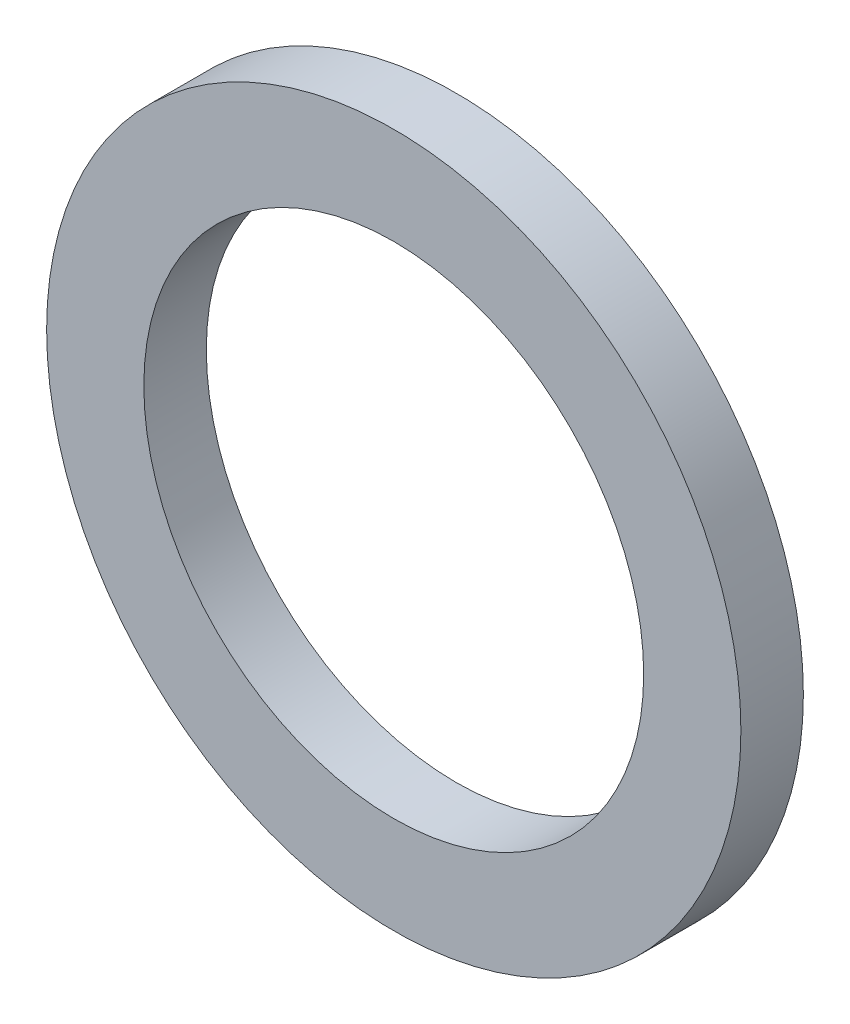
ISO-10303-21;
HEADER;
FILE_DESCRIPTION(('STEP AP214'),'2;1');
FILE_NAME('part.step','',(''),(''),'','','');
FILE_SCHEMA(('AUTOMOTIVE_DESIGN { 1 0 10303 214 1 1 1 1 }'));
ENDSEC;
DATA;
#1=APPLICATION_CONTEXT('core data for automotive mechanical design processes');
#2=APPLICATION_PROTOCOL_DEFINITION('international standard','automotive_design',2000,#1);
#3=PRODUCT_CONTEXT('',#1,'mechanical');
#4=PRODUCT('Part','Part','',(#3));
#5=PRODUCT_RELATED_PRODUCT_CATEGORY('part','',(#4));
#6=PRODUCT_DEFINITION_FORMATION('','',#4);
#7=PRODUCT_DEFINITION_CONTEXT('part definition',#1,'design');
#8=PRODUCT_DEFINITION('design','',#6,#7);
#9=PRODUCT_DEFINITION_SHAPE('','',#8);
#10=(LENGTH_UNIT() NAMED_UNIT(*) SI_UNIT(.MILLI.,.METRE.));
#11=(NAMED_UNIT(*) PLANE_ANGLE_UNIT() SI_UNIT($,.RADIAN.));
#12=(NAMED_UNIT(*) SI_UNIT($,.STERADIAN.) SOLID_ANGLE_UNIT());
#13=UNCERTAINTY_MEASURE_WITH_UNIT(LENGTH_MEASURE(1.E-05),#10,'distance_accuracy_value','');
#14=(GEOMETRIC_REPRESENTATION_CONTEXT(3) GLOBAL_UNCERTAINTY_ASSIGNED_CONTEXT((#13)) GLOBAL_UNIT_ASSIGNED_CONTEXT((#10,
#11,#12)) REPRESENTATION_CONTEXT('',''));
#15=CARTESIAN_POINT('',(0.,0.,0.));
#16=DIRECTION('',(0.,0.,1.));
#17=DIRECTION('',(1.,0.,0.));
#18=AXIS2_PLACEMENT_3D('',#15,#16,#17);
#19=CARTESIAN_POINT('',(0.,0.,-1.1));
#20=DIRECTION('',(0.,0.,1.));
#21=DIRECTION('',(1.,0.,0.));
#22=AXIS2_PLACEMENT_3D('',#19,#20,#21);
#23=CYLINDRICAL_SURFACE('',#22,7.2);
#24=CARTESIAN_POINT('',(0.,0.,0.9));
#25=DIRECTION('',(0.,0.,1.));
#26=DIRECTION('',(1.,0.,0.));
#27=AXIS2_PLACEMENT_3D('',#24,#25,#26);
#28=CIRCLE('',#27,7.2);
#29=CARTESIAN_POINT('',(7.2,0.,0.9));
#30=VERTEX_POINT('',#29);
#31=EDGE_CURVE('E21',#30,#30,#28,.T.);
#32=ORIENTED_EDGE('',*,*,#31,.T.);
#33=EDGE_LOOP('',(#32));
#34=FACE_BOUND('',#33,.T.);
#35=CARTESIAN_POINT('',(0.,0.,-0.9));
#36=DIRECTION('',(0.,0.,1.));
#37=DIRECTION('',(1.,0.,0.));
#38=AXIS2_PLACEMENT_3D('',#35,#36,#37);
#39=CIRCLE('',#38,7.2);
#40=CARTESIAN_POINT('',(7.2,0.,-0.9));
#41=VERTEX_POINT('',#40);
#42=EDGE_CURVE('E9',#41,#41,#39,.T.);
#43=ORIENTED_EDGE('',*,*,#42,.F.);
#44=EDGE_LOOP('',(#43));
#45=FACE_BOUND('',#44,.T.);
#46=ADVANCED_FACE('F14',(#34,#45),#23,.F.);
#47=CARTESIAN_POINT('',(0.,0.,-0.9));
#48=DIRECTION('',(0.,0.,1.));
#49=DIRECTION('',(1.,0.,0.));
#50=AXIS2_PLACEMENT_3D('',#47,#48,#49);
#51=PLANE('',#50);
#52=ORIENTED_EDGE('',*,*,#42,.T.);
#53=EDGE_LOOP('',(#52));
#54=FACE_BOUND('',#53,.T.);
#55=CARTESIAN_POINT('',(0.,0.,-0.9));
#56=DIRECTION('',(0.,0.,1.));
#57=DIRECTION('',(1.,0.,0.));
#58=AXIS2_PLACEMENT_3D('',#55,#56,#57);
#59=CIRCLE('',#58,10.);
#60=CARTESIAN_POINT('',(10.,0.,-0.9));
#61=VERTEX_POINT('',#60);
#62=EDGE_CURVE('E30',#61,#61,#59,.T.);
#63=ORIENTED_EDGE('',*,*,#62,.F.);
#64=EDGE_LOOP('',(#63));
#65=FACE_BOUND('',#64,.T.);
#66=ADVANCED_FACE('F54',(#54,#65),#51,.F.);
#67=CARTESIAN_POINT('',(0.,0.,0.9));
#68=DIRECTION('',(0.,0.,1.));
#69=DIRECTION('',(1.,0.,0.));
#70=AXIS2_PLACEMENT_3D('',#67,#68,#69);
#71=PLANE('',#70);
#72=ORIENTED_EDGE('',*,*,#31,.F.);
#73=EDGE_LOOP('',(#72));
#74=FACE_BOUND('',#73,.T.);
#75=CARTESIAN_POINT('',(0.,0.,0.9));
#76=DIRECTION('',(0.,0.,1.));
#77=DIRECTION('',(1.,0.,0.));
#78=AXIS2_PLACEMENT_3D('',#75,#76,#77);
#79=CIRCLE('',#78,10.);
#80=CARTESIAN_POINT('',(10.,0.,0.9));
#81=VERTEX_POINT('',#80);
#82=EDGE_CURVE('E37',#81,#81,#79,.T.);
#83=ORIENTED_EDGE('',*,*,#82,.T.);
#84=EDGE_LOOP('',(#83));
#85=FACE_BOUND('',#84,.T.);
#86=ADVANCED_FACE('F46',(#74,#85),#71,.T.);
#87=CARTESIAN_POINT('',(0.,0.,-0.9));
#88=DIRECTION('',(0.,0.,1.));
#89=DIRECTION('',(1.,0.,0.));
#90=AXIS2_PLACEMENT_3D('',#87,#88,#89);
#91=CYLINDRICAL_SURFACE('',#90,10.);
#92=ORIENTED_EDGE('',*,*,#82,.F.);
#93=EDGE_LOOP('',(#92));
#94=FACE_BOUND('',#93,.T.);
#95=ORIENTED_EDGE('',*,*,#62,.T.);
#96=EDGE_LOOP('',(#95));
#97=FACE_BOUND('',#96,.T.);
#98=ADVANCED_FACE('F48',(#94,#97),#91,.T.);
#99=CLOSED_SHELL('',(#46,#66,#86,#98));
#100=MANIFOLD_SOLID_BREP('B1',#99);
#101=ADVANCED_BREP_SHAPE_REPRESENTATION('',(#18,#100),#14);
#102=SHAPE_DEFINITION_REPRESENTATION(#9,#101);
ENDSEC;
END-ISO-10303-21;
